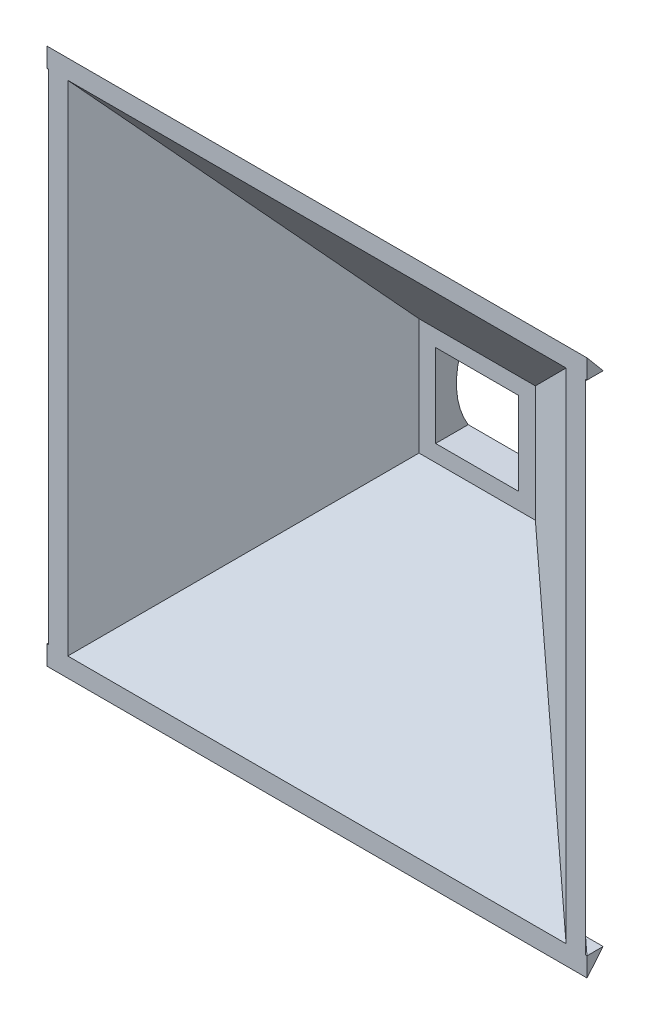
ISO-10303-21;
HEADER;
FILE_DESCRIPTION(('STEP AP214'),'2;1');
FILE_NAME('part.step','',(''),(''),'','','');
FILE_SCHEMA(('AUTOMOTIVE_DESIGN { 1 0 10303 214 1 1 1 1 }'));
ENDSEC;
DATA;
#1=APPLICATION_CONTEXT('core data for automotive mechanical design processes');
#2=APPLICATION_PROTOCOL_DEFINITION('international standard','automotive_design',2000,#1);
#3=PRODUCT_CONTEXT('',#1,'mechanical');
#4=PRODUCT('Part','Part','',(#3));
#5=PRODUCT_RELATED_PRODUCT_CATEGORY('part','',(#4));
#6=PRODUCT_DEFINITION_FORMATION('','',#4);
#7=PRODUCT_DEFINITION_CONTEXT('part definition',#1,'design');
#8=PRODUCT_DEFINITION('design','',#6,#7);
#9=PRODUCT_DEFINITION_SHAPE('','',#8);
#10=(LENGTH_UNIT() NAMED_UNIT(*) SI_UNIT(.MILLI.,.METRE.));
#11=(NAMED_UNIT(*) PLANE_ANGLE_UNIT() SI_UNIT($,.RADIAN.));
#12=(NAMED_UNIT(*) SI_UNIT($,.STERADIAN.) SOLID_ANGLE_UNIT());
#13=UNCERTAINTY_MEASURE_WITH_UNIT(LENGTH_MEASURE(1.E-05),#10,'distance_accuracy_value','');
#14=(GEOMETRIC_REPRESENTATION_CONTEXT(3) GLOBAL_UNCERTAINTY_ASSIGNED_CONTEXT((#13)) GLOBAL_UNIT_ASSIGNED_CONTEXT((#10,
#11,#12)) REPRESENTATION_CONTEXT('',''));
#15=CARTESIAN_POINT('',(0.,0.,0.));
#16=DIRECTION('',(0.,0.,1.));
#17=DIRECTION('',(1.,0.,0.));
#18=AXIS2_PLACEMENT_3D('',#15,#16,#17);
#19=CARTESIAN_POINT('',(-7.,30.,10.0594686833038));
#20=DIRECTION('',(0.642787609686543,0.,0.766044443118975));
#21=DIRECTION('',(0.766044443118975,0.,-0.642787609686543));
#22=AXIS2_PLACEMENT_3D('',#19,#20,#21);
#23=PLANE('',#22);
#24=DIRECTION('',(-0.607937743091542,0.608431543657136,0.510120336006866));
#25=VECTOR('',#24,1.);
#26=CARTESIAN_POINT('',(-16.3635474571613,14.0566394287994,17.9164179011189));
#27=LINE('',#26,#25);
#28=CARTESIAN_POINT('',(-9.31263516821422,7.,12.));
#29=VERTEX_POINT('',#28);
#30=CARTESIAN_POINT('',(-32.2939684617835,30.,31.2836282905963));
#31=VERTEX_POINT('',#30);
#32=EDGE_CURVE('E362',#29,#31,#27,.T.);
#33=ORIENTED_EDGE('',*,*,#32,.F.);
#34=DIRECTION('',(-0.766044443118975,0.,0.642787609686543));
#35=VECTOR('',#34,1.);
#36=CARTESIAN_POINT('',(-6.99999999999999,7.,10.0594686833038));
#37=LINE('',#36,#35);
#38=CARTESIAN_POINT('',(-6.99999999999999,7.,10.0594686833038));
#39=VERTEX_POINT('',#38);
#40=EDGE_CURVE('E370',#39,#29,#37,.T.);
#41=ORIENTED_EDGE('',*,*,#40,.F.);
#42=DIRECTION('',(0.,-1.,0.));
#43=VECTOR('',#42,1.);
#44=CARTESIAN_POINT('',(-7.,30.,10.0594686833038));
#45=LINE('',#44,#43);
#46=CARTESIAN_POINT('',(-6.99999999999999,-7.,10.0594686833038));
#47=VERTEX_POINT('',#46);
#48=EDGE_CURVE('E417',#39,#47,#45,.T.);
#49=ORIENTED_EDGE('',*,*,#48,.T.);
#50=DIRECTION('',(0.766044443118975,0.,-0.642787609686543));
#51=VECTOR('',#50,1.);
#52=CARTESIAN_POINT('',(-7.00000000000001,-7.,10.0594686833038));
#53=LINE('',#52,#51);
#54=CARTESIAN_POINT('',(-9.31263516821424,-7.,12.));
#55=VERTEX_POINT('',#54);
#56=EDGE_CURVE('E67',#55,#47,#53,.T.);
#57=ORIENTED_EDGE('',*,*,#56,.F.);
#58=DIRECTION('',(0.607937743091542,0.608431543657136,-0.510120336006866));
#59=VECTOR('',#58,1.);
#60=CARTESIAN_POINT('',(5.82976251143604,8.15469717022086,-0.705980308134369));
#61=LINE('',#60,#59);
#62=CARTESIAN_POINT('',(-32.2939684617835,-30.,31.2836282905963));
#63=VERTEX_POINT('',#62);
#64=EDGE_CURVE('E400',#63,#55,#61,.T.);
#65=ORIENTED_EDGE('',*,*,#64,.F.);
#66=DIRECTION('',(0.,-1.,0.));
#67=VECTOR('',#66,1.);
#68=CARTESIAN_POINT('',(-32.2939684617835,30.,31.2836282905963));
#69=LINE('',#68,#67);
#70=EDGE_CURVE('E420',#31,#63,#69,.T.);
#71=ORIENTED_EDGE('',*,*,#70,.F.);
#72=EDGE_LOOP('',(#33,#41,#49,#57,#65,#71));
#73=FACE_BOUND('',#72,.T.);
#74=ADVANCED_FACE('F43',(#73),#23,.F.);
#75=CARTESIAN_POINT('',(-7.,30.,12.));
#76=DIRECTION('',(-0.642787609686543,0.,-0.766044443118975));
#77=DIRECTION('',(-0.766044443118975,0.,0.642787609686543));
#78=AXIS2_PLACEMENT_3D('',#75,#76,#77);
#79=PLANE('',#78);
#80=DIRECTION('',(0.607937743091542,-0.608431543657135,-0.510120336006866));
#81=VECTOR('',#80,1.);
#82=CARTESIAN_POINT('',(-15.5074354879623,15.5143456962911,19.1385859802137));
#83=LINE('',#82,#81);
#84=CARTESIAN_POINT('',(-29.9813332935693,30.,31.2836282905963));
#85=VERTEX_POINT('',#84);
#86=CARTESIAN_POINT('',(-7.,7.,12.));
#87=VERTEX_POINT('',#86);
#88=EDGE_CURVE('E358',#85,#87,#83,.T.);
#89=ORIENTED_EDGE('',*,*,#88,.F.);
#90=DIRECTION('',(0.,-1.,0.));
#91=VECTOR('',#90,1.);
#92=CARTESIAN_POINT('',(-29.9813332935693,30.,31.2836282905963));
#93=LINE('',#92,#91);
#94=CARTESIAN_POINT('',(-29.9813332935693,-30.,31.2836282905963));
#95=VERTEX_POINT('',#94);
#96=EDGE_CURVE('E412',#85,#95,#93,.T.);
#97=ORIENTED_EDGE('',*,*,#96,.T.);
#98=DIRECTION('',(-0.607937743091542,-0.608431543657135,0.510120336006866));
#99=VECTOR('',#98,1.);
#100=CARTESIAN_POINT('',(6.68587448063501,6.69699090272918,0.516187770960505));
#101=LINE('',#100,#99);
#102=CARTESIAN_POINT('',(-7.,-7.,12.));
#103=VERTEX_POINT('',#102);
#104=EDGE_CURVE('E396',#103,#95,#101,.T.);
#105=ORIENTED_EDGE('',*,*,#104,.F.);
#106=DIRECTION('',(0.,-1.,0.));
#107=VECTOR('',#106,1.);
#108=CARTESIAN_POINT('',(-7.,7.,12.));
#109=LINE('',#108,#107);
#110=EDGE_CURVE('E484',#87,#103,#109,.T.);
#111=ORIENTED_EDGE('',*,*,#110,.F.);
#112=EDGE_LOOP('',(#89,#97,#105,#111));
#113=FACE_BOUND('',#112,.T.);
#114=ADVANCED_FACE('F594',(#113),#79,.F.);
#115=CARTESIAN_POINT('',(7.,30.,10.0594686833038));
#116=DIRECTION('',(-0.642787609686543,0.,0.766044443118975));
#117=DIRECTION('',(0.766044443118975,0.,0.642787609686543));
#118=AXIS2_PLACEMENT_3D('',#115,#116,#117);
#119=PLANE('',#118);
#120=DIRECTION('',(-0.607937743091542,-0.608431543657136,-0.510120336006866));
#121=VECTOR('',#120,1.);
#122=CARTESIAN_POINT('',(16.3635474571613,14.0566394287994,17.9164179011189));
#123=LINE('',#122,#121);
#124=CARTESIAN_POINT('',(32.2939684617835,30.,31.2836282905963));
#125=VERTEX_POINT('',#124);
#126=CARTESIAN_POINT('',(9.31263516821424,7.,12.));
#127=VERTEX_POINT('',#126);
#128=EDGE_CURVE('E354',#125,#127,#123,.T.);
#129=ORIENTED_EDGE('',*,*,#128,.F.);
#130=DIRECTION('',(0.,-1.,0.));
#131=VECTOR('',#130,1.);
#132=CARTESIAN_POINT('',(32.2939684617835,30.,31.2836282905963));
#133=LINE('',#132,#131);
#134=CARTESIAN_POINT('',(32.2939684617835,-30.,31.2836282905963));
#135=VERTEX_POINT('',#134);
#136=EDGE_CURVE('E405',#125,#135,#133,.T.);
#137=ORIENTED_EDGE('',*,*,#136,.T.);
#138=DIRECTION('',(0.607937743091542,-0.608431543657136,0.510120336006866));
#139=VECTOR('',#138,1.);
#140=CARTESIAN_POINT('',(-5.82976251143604,8.15469717022086,-0.705980308134369));
#141=LINE('',#140,#139);
#142=CARTESIAN_POINT('',(9.31263516821424,-7.,12.));
#143=VERTEX_POINT('',#142);
#144=EDGE_CURVE('E392',#143,#135,#141,.T.);
#145=ORIENTED_EDGE('',*,*,#144,.F.);
#146=DIRECTION('',(0.766044443118975,0.,0.642787609686543));
#147=VECTOR('',#146,1.);
#148=CARTESIAN_POINT('',(7.00000000000001,-7.,10.0594686833038));
#149=LINE('',#148,#147);
#150=CARTESIAN_POINT('',(7.,-7.,10.0594686833038));
#151=VERTEX_POINT('',#150);
#152=EDGE_CURVE('E52',#151,#143,#149,.T.);
#153=ORIENTED_EDGE('',*,*,#152,.F.);
#154=DIRECTION('',(0.,-1.,0.));
#155=VECTOR('',#154,1.);
#156=CARTESIAN_POINT('',(7.,30.,10.0594686833038));
#157=LINE('',#156,#155);
#158=CARTESIAN_POINT('',(7.,7.,10.0594686833038));
#159=VERTEX_POINT('',#158);
#160=EDGE_CURVE('E413',#159,#151,#157,.T.);
#161=ORIENTED_EDGE('',*,*,#160,.F.);
#162=DIRECTION('',(-0.766044443118975,0.,-0.642787609686543));
#163=VECTOR('',#162,1.);
#164=CARTESIAN_POINT('',(6.99999999999999,7.,10.0594686833038));
#165=LINE('',#164,#163);
#166=EDGE_CURVE('E366',#127,#159,#165,.T.);
#167=ORIENTED_EDGE('',*,*,#166,.F.);
#168=EDGE_LOOP('',(#129,#137,#145,#153,#161,#167));
#169=FACE_BOUND('',#168,.T.);
#170=ADVANCED_FACE('F519',(#169),#119,.F.);
#171=CARTESIAN_POINT('',(7.,30.,12.));
#172=DIRECTION('',(0.642787609686543,0.,-0.766044443118975));
#173=DIRECTION('',(-0.766044443118975,0.,-0.642787609686543));
#174=AXIS2_PLACEMENT_3D('',#171,#172,#173);
#175=PLANE('',#174);
#176=DIRECTION('',(0.607937743091542,0.608431543657135,0.510120336006866));
#177=VECTOR('',#176,1.);
#178=CARTESIAN_POINT('',(15.5074354879623,15.5143456962911,19.1385859802137));
#179=LINE('',#178,#177);
#180=CARTESIAN_POINT('',(7.,7.,12.));
#181=VERTEX_POINT('',#180);
#182=CARTESIAN_POINT('',(29.9813332935693,30.,31.2836282905963));
#183=VERTEX_POINT('',#182);
#184=EDGE_CURVE('E350',#181,#183,#179,.T.);
#185=ORIENTED_EDGE('',*,*,#184,.F.);
#186=DIRECTION('',(0.,1.,0.));
#187=VECTOR('',#186,1.);
#188=CARTESIAN_POINT('',(7.,7.,12.));
#189=LINE('',#188,#187);
#190=CARTESIAN_POINT('',(7.,-7.,12.));
#191=VERTEX_POINT('',#190);
#192=EDGE_CURVE('E492',#191,#181,#189,.T.);
#193=ORIENTED_EDGE('',*,*,#192,.F.);
#194=DIRECTION('',(-0.607937743091542,0.608431543657135,-0.510120336006866));
#195=VECTOR('',#194,1.);
#196=CARTESIAN_POINT('',(-6.68587448063501,6.69699090272918,0.516187770960505));
#197=LINE('',#196,#195);
#198=CARTESIAN_POINT('',(29.9813332935693,-30.,31.2836282905963));
#199=VERTEX_POINT('',#198);
#200=EDGE_CURVE('E387',#199,#191,#197,.T.);
#201=ORIENTED_EDGE('',*,*,#200,.F.);
#202=DIRECTION('',(0.,-1.,0.));
#203=VECTOR('',#202,1.);
#204=CARTESIAN_POINT('',(29.9813332935693,30.,31.2836282905963));
#205=LINE('',#204,#203);
#206=EDGE_CURVE('E408',#183,#199,#205,.T.);
#207=ORIENTED_EDGE('',*,*,#206,.F.);
#208=EDGE_LOOP('',(#185,#193,#201,#207));
#209=FACE_BOUND('',#208,.T.);
#210=ADVANCED_FACE('F602',(#209),#175,.F.);
#211=CARTESIAN_POINT('',(-7.,7.,12.));
#212=DIRECTION('',(0.,-1.,0.));
#213=DIRECTION('',(0.,0.,-1.));
#214=AXIS2_PLACEMENT_3D('',#211,#212,#213);
#215=PLANE('',#214);
#216=DIRECTION('',(-1.,0.,0.));
#217=VECTOR('',#216,1.);
#218=CARTESIAN_POINT('',(32.5,7.,10.0594686833038));
#219=LINE('',#218,#217);
#220=EDGE_CURVE('E342',#159,#39,#219,.T.);
#221=ORIENTED_EDGE('',*,*,#220,.F.);
#222=DIRECTION('',(0.,0.,-1.));
#223=VECTOR('',#222,1.);
#224=CARTESIAN_POINT('',(7.,7.,12.));
#225=LINE('',#224,#223);
#226=CARTESIAN_POINT('',(7.,7.,6.42261628933256));
#227=VERTEX_POINT('',#226);
#228=EDGE_CURVE('E496',#159,#227,#225,.T.);
#229=ORIENTED_EDGE('',*,*,#228,.T.);
#230=DIRECTION('',(1.,0.,0.));
#231=VECTOR('',#230,1.);
#232=CARTESIAN_POINT('',(-23.,7.,6.42261628933256));
#233=LINE('',#232,#231);
#234=CARTESIAN_POINT('',(-7.,7.,6.42261628933256));
#235=VERTEX_POINT('',#234);
#236=EDGE_CURVE('E448',#227,#235,#233,.F.);
#237=ORIENTED_EDGE('',*,*,#236,.T.);
#238=DIRECTION('',(0.,0.,-1.));
#239=VECTOR('',#238,1.);
#240=CARTESIAN_POINT('',(-7.,7.,12.));
#241=LINE('',#240,#239);
#242=EDGE_CURVE('E505',#39,#235,#241,.T.);
#243=ORIENTED_EDGE('',*,*,#242,.F.);
#244=EDGE_LOOP('',(#221,#229,#237,#243));
#245=FACE_BOUND('',#244,.T.);
#246=ADVANCED_FACE('F45',(#245),#215,.F.);
#247=CARTESIAN_POINT('',(-7.,-7.,12.));
#248=DIRECTION('',(0.,1.,0.));
#249=DIRECTION('',(0.,0.,1.));
#250=AXIS2_PLACEMENT_3D('',#247,#248,#249);
#251=PLANE('',#250);
#252=DIRECTION('',(-1.,0.,0.));
#253=VECTOR('',#252,1.);
#254=CARTESIAN_POINT('',(32.5,-7.,10.0594686833038));
#255=LINE('',#254,#253);
#256=EDGE_CURVE('E378',#151,#47,#255,.T.);
#257=ORIENTED_EDGE('',*,*,#256,.T.);
#258=DIRECTION('',(0.,0.,-1.));
#259=VECTOR('',#258,1.);
#260=CARTESIAN_POINT('',(-7.,-7.,12.));
#261=LINE('',#260,#259);
#262=CARTESIAN_POINT('',(-7.,-7.,6.42261628933256));
#263=VERTEX_POINT('',#262);
#264=EDGE_CURVE('E502',#47,#263,#261,.T.);
#265=ORIENTED_EDGE('',*,*,#264,.T.);
#266=DIRECTION('',(1.,0.,0.));
#267=VECTOR('',#266,1.);
#268=CARTESIAN_POINT('',(-23.,-7.,6.42261628933256));
#269=LINE('',#268,#267);
#270=CARTESIAN_POINT('',(7.,-7.,6.42261628933256));
#271=VERTEX_POINT('',#270);
#272=EDGE_CURVE('E440',#263,#271,#269,.T.);
#273=ORIENTED_EDGE('',*,*,#272,.T.);
#274=DIRECTION('',(0.,0.,-1.));
#275=VECTOR('',#274,1.);
#276=CARTESIAN_POINT('',(7.,-7.,12.));
#277=LINE('',#276,#275);
#278=EDGE_CURVE('E499',#151,#271,#277,.T.);
#279=ORIENTED_EDGE('',*,*,#278,.F.);
#280=EDGE_LOOP('',(#257,#265,#273,#279));
#281=FACE_BOUND('',#280,.T.);
#282=ADVANCED_FACE('F529',(#281),#251,.F.);
#283=CARTESIAN_POINT('',(-7.,7.,12.));
#284=DIRECTION('',(1.,0.,0.));
#285=DIRECTION('',(0.,0.,-1.));
#286=AXIS2_PLACEMENT_3D('',#283,#284,#285);
#287=PLANE('',#286);
#288=ORIENTED_EDGE('',*,*,#48,.F.);
#289=ORIENTED_EDGE('',*,*,#242,.T.);
#290=CARTESIAN_POINT('',(-7.,0.,0.));
#291=DIRECTION('',(1.,0.,0.));
#292=DIRECTION('',(0.,0.,-1.));
#293=AXIS2_PLACEMENT_3D('',#290,#291,#292);
#294=CIRCLE('',#293,9.5);
#295=EDGE_CURVE('E444',#235,#263,#294,.T.);
#296=ORIENTED_EDGE('',*,*,#295,.T.);
#297=ORIENTED_EDGE('',*,*,#264,.F.);
#298=EDGE_LOOP('',(#288,#289,#296,#297));
#299=FACE_BOUND('',#298,.T.);
#300=ADVANCED_FACE('F541',(#299),#287,.F.);
#301=CARTESIAN_POINT('',(0.,0.,12.));
#302=DIRECTION('',(0.,0.,-1.));
#303=DIRECTION('',(-1.,0.,0.));
#304=AXIS2_PLACEMENT_3D('',#301,#302,#303);
#305=PLANE('',#304);
#306=DIRECTION('',(-1.,0.,0.));
#307=VECTOR('',#306,1.);
#308=CARTESIAN_POINT('',(-7.,7.,12.));
#309=LINE('',#308,#307);
#310=EDGE_CURVE('E481',#181,#87,#309,.T.);
#311=ORIENTED_EDGE('',*,*,#310,.T.);
#312=ORIENTED_EDGE('',*,*,#110,.T.);
#313=DIRECTION('',(1.,0.,0.));
#314=VECTOR('',#313,1.);
#315=CARTESIAN_POINT('',(-7.,-7.,12.));
#316=LINE('',#315,#314);
#317=EDGE_CURVE('E488',#103,#191,#316,.T.);
#318=ORIENTED_EDGE('',*,*,#317,.T.);
#319=ORIENTED_EDGE('',*,*,#192,.T.);
#320=EDGE_LOOP('',(#311,#312,#318,#319));
#321=FACE_BOUND('',#320,.T.);
#322=DIRECTION('',(0.,1.,0.));
#323=VECTOR('',#322,1.);
#324=CARTESIAN_POINT('',(5.,5.,12.));
#325=LINE('',#324,#323);
#326=CARTESIAN_POINT('',(5.,-5.,12.));
#327=VERTEX_POINT('',#326);
#328=CARTESIAN_POINT('',(5.,5.,12.));
#329=VERTEX_POINT('',#328);
#330=EDGE_CURVE('E452',#327,#329,#325,.T.);
#331=ORIENTED_EDGE('',*,*,#330,.F.);
#332=DIRECTION('',(1.,0.,0.));
#333=VECTOR('',#332,1.);
#334=CARTESIAN_POINT('',(-5.,-5.,12.));
#335=LINE('',#334,#333);
#336=CARTESIAN_POINT('',(-5.,-5.,12.));
#337=VERTEX_POINT('',#336);
#338=EDGE_CURVE('E462',#337,#327,#335,.T.);
#339=ORIENTED_EDGE('',*,*,#338,.F.);
#340=DIRECTION('',(0.,-1.,0.));
#341=VECTOR('',#340,1.);
#342=CARTESIAN_POINT('',(-5.,5.,12.));
#343=LINE('',#342,#341);
#344=CARTESIAN_POINT('',(-5.,5.,12.));
#345=VERTEX_POINT('',#344);
#346=EDGE_CURVE('E458',#345,#337,#343,.T.);
#347=ORIENTED_EDGE('',*,*,#346,.F.);
#348=DIRECTION('',(-1.,0.,0.));
#349=VECTOR('',#348,1.);
#350=CARTESIAN_POINT('',(-5.,5.,12.));
#351=LINE('',#350,#349);
#352=EDGE_CURVE('E455',#329,#345,#351,.T.);
#353=ORIENTED_EDGE('',*,*,#352,.F.);
#354=EDGE_LOOP('',(#331,#339,#347,#353));
#355=FACE_BOUND('',#354,.T.);
#356=ADVANCED_FACE('F596',(#321,#355),#305,.F.);
#357=CARTESIAN_POINT('',(7.,7.,12.));
#358=DIRECTION('',(-1.,0.,0.));
#359=DIRECTION('',(0.,0.,1.));
#360=AXIS2_PLACEMENT_3D('',#357,#358,#359);
#361=PLANE('',#360);
#362=ORIENTED_EDGE('',*,*,#228,.F.);
#363=ORIENTED_EDGE('',*,*,#160,.T.);
#364=ORIENTED_EDGE('',*,*,#278,.T.);
#365=CARTESIAN_POINT('',(7.,0.,0.));
#366=DIRECTION('',(1.,0.,0.));
#367=DIRECTION('',(0.,0.,-1.));
#368=AXIS2_PLACEMENT_3D('',#365,#366,#367);
#369=CIRCLE('',#368,9.5);
#370=EDGE_CURVE('E424',#227,#271,#369,.T.);
#371=ORIENTED_EDGE('',*,*,#370,.F.);
#372=EDGE_LOOP('',(#362,#363,#364,#371));
#373=FACE_BOUND('',#372,.T.);
#374=ADVANCED_FACE('F524',(#373),#361,.F.);
#375=CARTESIAN_POINT('',(5.,5.,12.));
#376=DIRECTION('',(-1.,0.,0.));
#377=DIRECTION('',(0.,0.,1.));
#378=AXIS2_PLACEMENT_3D('',#375,#376,#377);
#379=PLANE('',#378);
#380=CARTESIAN_POINT('',(5.,0.,0.));
#381=DIRECTION('',(-1.,0.,0.));
#382=DIRECTION('',(0.,0.,1.));
#383=AXIS2_PLACEMENT_3D('',#380,#381,#382);
#384=CIRCLE('',#383,9.5);
#385=CARTESIAN_POINT('',(5.,-5.,8.07774721070176));
#386=VERTEX_POINT('',#385);
#387=CARTESIAN_POINT('',(5.,5.,8.07774721070176));
#388=VERTEX_POINT('',#387);
#389=EDGE_CURVE('E437',#386,#388,#384,.T.);
#390=ORIENTED_EDGE('',*,*,#389,.F.);
#391=DIRECTION('',(0.,0.,-1.));
#392=VECTOR('',#391,1.);
#393=CARTESIAN_POINT('',(5.,-5.,12.));
#394=LINE('',#393,#392);
#395=EDGE_CURVE('E465',#327,#386,#394,.T.);
#396=ORIENTED_EDGE('',*,*,#395,.F.);
#397=ORIENTED_EDGE('',*,*,#330,.T.);
#398=DIRECTION('',(0.,0.,-1.));
#399=VECTOR('',#398,1.);
#400=CARTESIAN_POINT('',(5.,5.,12.));
#401=LINE('',#400,#399);
#402=EDGE_CURVE('E477',#329,#388,#401,.T.);
#403=ORIENTED_EDGE('',*,*,#402,.T.);
#404=EDGE_LOOP('',(#390,#396,#397,#403));
#405=FACE_BOUND('',#404,.T.);
#406=ADVANCED_FACE('F633',(#405),#379,.T.);
#407=CARTESIAN_POINT('',(-5.,5.,12.));
#408=DIRECTION('',(0.,-1.,0.));
#409=DIRECTION('',(0.,0.,-1.));
#410=AXIS2_PLACEMENT_3D('',#407,#408,#409);
#411=PLANE('',#410);
#412=DIRECTION('',(1.,0.,0.));
#413=VECTOR('',#412,1.);
#414=CARTESIAN_POINT('',(-23.,5.,8.07774721070176));
#415=LINE('',#414,#413);
#416=CARTESIAN_POINT('',(-5.,5.,8.07774721070176));
#417=VERTEX_POINT('',#416);
#418=EDGE_CURVE('E434',#388,#417,#415,.F.);
#419=ORIENTED_EDGE('',*,*,#418,.F.);
#420=ORIENTED_EDGE('',*,*,#402,.F.);
#421=ORIENTED_EDGE('',*,*,#352,.T.);
#422=DIRECTION('',(0.,0.,-1.));
#423=VECTOR('',#422,1.);
#424=CARTESIAN_POINT('',(-5.,5.,12.));
#425=LINE('',#424,#423);
#426=EDGE_CURVE('E473',#345,#417,#425,.T.);
#427=ORIENTED_EDGE('',*,*,#426,.T.);
#428=EDGE_LOOP('',(#419,#420,#421,#427));
#429=FACE_BOUND('',#428,.T.);
#430=ADVANCED_FACE('F629',(#429),#411,.T.);
#431=CARTESIAN_POINT('',(-5.,5.,12.));
#432=DIRECTION('',(1.,0.,0.));
#433=DIRECTION('',(0.,0.,-1.));
#434=AXIS2_PLACEMENT_3D('',#431,#432,#433);
#435=PLANE('',#434);
#436=CARTESIAN_POINT('',(-5.,0.,0.));
#437=DIRECTION('',(1.,0.,0.));
#438=DIRECTION('',(0.,0.,-1.));
#439=AXIS2_PLACEMENT_3D('',#436,#437,#438);
#440=CIRCLE('',#439,9.5);
#441=CARTESIAN_POINT('',(-5.,-5.,8.07774721070176));
#442=VERTEX_POINT('',#441);
#443=EDGE_CURVE('E431',#417,#442,#440,.T.);
#444=ORIENTED_EDGE('',*,*,#443,.F.);
#445=ORIENTED_EDGE('',*,*,#426,.F.);
#446=ORIENTED_EDGE('',*,*,#346,.T.);
#447=DIRECTION('',(0.,0.,-1.));
#448=VECTOR('',#447,1.);
#449=CARTESIAN_POINT('',(-5.,-5.,12.));
#450=LINE('',#449,#448);
#451=EDGE_CURVE('E469',#337,#442,#450,.T.);
#452=ORIENTED_EDGE('',*,*,#451,.T.);
#453=EDGE_LOOP('',(#444,#445,#446,#452));
#454=FACE_BOUND('',#453,.T.);
#455=ADVANCED_FACE('F625',(#454),#435,.T.);
#456=CARTESIAN_POINT('',(-5.,-5.,12.));
#457=DIRECTION('',(0.,1.,0.));
#458=DIRECTION('',(0.,0.,1.));
#459=AXIS2_PLACEMENT_3D('',#456,#457,#458);
#460=PLANE('',#459);
#461=DIRECTION('',(1.,0.,0.));
#462=VECTOR('',#461,1.);
#463=CARTESIAN_POINT('',(-23.,-5.,8.07774721070176));
#464=LINE('',#463,#462);
#465=EDGE_CURVE('E427',#442,#386,#464,.T.);
#466=ORIENTED_EDGE('',*,*,#465,.F.);
#467=ORIENTED_EDGE('',*,*,#451,.F.);
#468=ORIENTED_EDGE('',*,*,#338,.T.);
#469=ORIENTED_EDGE('',*,*,#395,.T.);
#470=EDGE_LOOP('',(#466,#467,#468,#469));
#471=FACE_BOUND('',#470,.T.);
#472=ADVANCED_FACE('F621',(#471),#460,.T.);
#473=CARTESIAN_POINT('',(-23.,0.,0.));
#474=DIRECTION('',(1.,0.,0.));
#475=DIRECTION('',(0.,0.,-1.));
#476=AXIS2_PLACEMENT_3D('',#473,#474,#475);
#477=CYLINDRICAL_SURFACE('',#476,9.5);
#478=ORIENTED_EDGE('',*,*,#389,.T.);
#479=ORIENTED_EDGE('',*,*,#418,.T.);
#480=ORIENTED_EDGE('',*,*,#443,.T.);
#481=ORIENTED_EDGE('',*,*,#465,.T.);
#482=EDGE_LOOP('',(#478,#479,#480,#481));
#483=FACE_BOUND('',#482,.T.);
#484=ORIENTED_EDGE('',*,*,#370,.T.);
#485=ORIENTED_EDGE('',*,*,#272,.F.);
#486=ORIENTED_EDGE('',*,*,#295,.F.);
#487=ORIENTED_EDGE('',*,*,#236,.F.);
#488=EDGE_LOOP('',(#484,#485,#486,#487));
#489=FACE_BOUND('',#488,.T.);
#490=ADVANCED_FACE('F544',(#483,#489),#477,.F.);
#491=CARTESIAN_POINT('',(-32.2939684617835,30.,31.2836282905963));
#492=DIRECTION('',(0.,0.,-1.));
#493=DIRECTION('',(-1.,0.,0.));
#494=AXIS2_PLACEMENT_3D('',#491,#492,#493);
#495=PLANE('',#494);
#496=ORIENTED_EDGE('',*,*,#96,.F.);
#497=DIRECTION('',(-1.,0.,0.));
#498=VECTOR('',#497,1.);
#499=CARTESIAN_POINT('',(32.5,30.,31.2836282905963));
#500=LINE('',#499,#498);
#501=EDGE_CURVE('E343',#183,#85,#500,.T.);
#502=ORIENTED_EDGE('',*,*,#501,.F.);
#503=ORIENTED_EDGE('',*,*,#206,.T.);
#504=DIRECTION('',(-1.,0.,0.));
#505=VECTOR('',#504,1.);
#506=CARTESIAN_POINT('',(32.5,-30.,31.2836282905963));
#507=LINE('',#506,#505);
#508=EDGE_CURVE('E388',#199,#95,#507,.T.);
#509=ORIENTED_EDGE('',*,*,#508,.T.);
#510=EDGE_LOOP('',(#496,#502,#503,#509));
#511=FACE_BOUND('',#510,.T.);
#512=ORIENTED_EDGE('',*,*,#70,.T.);
#513=CARTESIAN_POINT('',(-32.5,-30.,31.2836282905963));
#514=VERTEX_POINT('',#513);
#515=EDGE_CURVE('E382',#63,#514,#507,.T.);
#516=ORIENTED_EDGE('',*,*,#515,.T.);
#517=DIRECTION('',(0.,-1.,0.));
#518=VECTOR('',#517,1.);
#519=CARTESIAN_POINT('',(-32.5,-32.3145136180507,31.2836282905963));
#520=LINE('',#519,#518);
#521=CARTESIAN_POINT('',(-32.5,-32.3145136180507,31.2836282905963));
#522=VERTEX_POINT('',#521);
#523=EDGE_CURVE('E245',#514,#522,#520,.T.);
#524=ORIENTED_EDGE('',*,*,#523,.T.);
#525=DIRECTION('',(-1.,0.,0.));
#526=VECTOR('',#525,1.);
#527=CARTESIAN_POINT('',(32.5,-32.3145136180507,31.2836282905963));
#528=LINE('',#527,#526);
#529=CARTESIAN_POINT('',(32.5,-32.3145136180507,31.2836282905963));
#530=VERTEX_POINT('',#529);
#531=EDGE_CURVE('E279',#530,#522,#528,.T.);
#532=ORIENTED_EDGE('',*,*,#531,.F.);
#533=DIRECTION('',(0.,-1.,0.));
#534=VECTOR('',#533,1.);
#535=CARTESIAN_POINT('',(32.5,-32.3145136180507,31.2836282905963));
#536=LINE('',#535,#534);
#537=CARTESIAN_POINT('',(32.5,-30.,31.2836282905963));
#538=VERTEX_POINT('',#537);
#539=EDGE_CURVE('E256',#538,#530,#536,.T.);
#540=ORIENTED_EDGE('',*,*,#539,.F.);
#541=EDGE_CURVE('E383',#538,#135,#507,.T.);
#542=ORIENTED_EDGE('',*,*,#541,.T.);
#543=ORIENTED_EDGE('',*,*,#136,.F.);
#544=CARTESIAN_POINT('',(32.5,30.,31.2836282905963));
#545=VERTEX_POINT('',#544);
#546=EDGE_CURVE('E339',#545,#125,#500,.T.);
#547=ORIENTED_EDGE('',*,*,#546,.F.);
#548=DIRECTION('',(0.,-1.,0.));
#549=VECTOR('',#548,1.);
#550=CARTESIAN_POINT('',(32.5,32.3145136180506,31.2836282905963));
#551=LINE('',#550,#549);
#552=CARTESIAN_POINT('',(32.5,32.3145136180506,31.2836282905963));
#553=VERTEX_POINT('',#552);
#554=EDGE_CURVE('E232',#553,#545,#551,.T.);
#555=ORIENTED_EDGE('',*,*,#554,.F.);
#556=DIRECTION('',(-1.,0.,0.));
#557=VECTOR('',#556,1.);
#558=CARTESIAN_POINT('',(32.5,32.3145136180506,31.2836282905963));
#559=LINE('',#558,#557);
#560=CARTESIAN_POINT('',(-32.5,32.3145136180506,31.2836282905963));
#561=VERTEX_POINT('',#560);
#562=EDGE_CURVE('E227',#553,#561,#559,.T.);
#563=ORIENTED_EDGE('',*,*,#562,.T.);
#564=DIRECTION('',(0.,-1.,0.));
#565=VECTOR('',#564,1.);
#566=CARTESIAN_POINT('',(-32.5,32.3145136180506,31.2836282905963));
#567=LINE('',#566,#565);
#568=CARTESIAN_POINT('',(-32.5,30.,31.2836282905963));
#569=VERTEX_POINT('',#568);
#570=EDGE_CURVE('E240',#561,#569,#567,.T.);
#571=ORIENTED_EDGE('',*,*,#570,.T.);
#572=EDGE_CURVE('E338',#31,#569,#500,.T.);
#573=ORIENTED_EDGE('',*,*,#572,.F.);
#574=EDGE_LOOP('',(#512,#516,#524,#532,#540,#542,#543,#547,#555,#563,#571,#573));
#575=FACE_BOUND('',#574,.T.);
#576=ADVANCED_FACE('F554',(#511,#575),#495,.F.);
#577=CARTESIAN_POINT('',(32.5,-7.,12.));
#578=DIRECTION('',(0.,-0.642481319030199,-0.766301347184785));
#579=DIRECTION('',(0.,0.766301347184785,-0.642481319030199));
#580=AXIS2_PLACEMENT_3D('',#577,#578,#579);
#581=PLANE('',#580);
#582=ORIENTED_EDGE('',*,*,#317,.F.);
#583=ORIENTED_EDGE('',*,*,#104,.T.);
#584=ORIENTED_EDGE('',*,*,#508,.F.);
#585=ORIENTED_EDGE('',*,*,#200,.T.);
#586=EDGE_LOOP('',(#582,#583,#584,#585));
#587=FACE_BOUND('',#586,.T.);
#588=ADVANCED_FACE('F591',(#587),#581,.F.);
#589=CARTESIAN_POINT('',(32.5,-7.,10.0594686833038));
#590=DIRECTION('',(0.,-1.,0.));
#591=DIRECTION('',(0.,0.,-1.));
#592=AXIS2_PLACEMENT_3D('',#589,#590,#591);
#593=PLANE('',#592);
#594=DIRECTION('',(-1.,0.,0.));
#595=VECTOR('',#594,1.);
#596=CARTESIAN_POINT('',(32.5,-7.,12.));
#597=LINE('',#596,#595);
#598=CARTESIAN_POINT('',(9.33147269391767,-7.,12.));
#599=VERTEX_POINT('',#598);
#600=EDGE_CURVE('E375',#599,#143,#597,.T.);
#601=ORIENTED_EDGE('',*,*,#600,.F.);
#602=DIRECTION('',(-0.76860418999111,0.,-0.63972462757667));
#603=VECTOR('',#602,1.);
#604=CARTESIAN_POINT('',(22.0641862222332,-6.99999999999999,22.5976919278001));
#605=LINE('',#604,#603);
#606=EDGE_CURVE('E328',#599,#151,#605,.T.);
#607=ORIENTED_EDGE('',*,*,#606,.T.);
#608=ORIENTED_EDGE('',*,*,#152,.T.);
#609=EDGE_LOOP('',(#601,#607,#608));
#610=FACE_BOUND('',#609,.T.);
#611=ADVANCED_FACE('F514',(#610),#593,.F.);
#612=ORIENTED_EDGE('',*,*,#541,.F.);
#613=DIRECTION('',(-0.611045442878352,0.606600713136935,-0.50858533360623));
#614=VECTOR('',#613,1.);
#615=CARTESIAN_POINT('',(17.982057100258,-15.5876602650352,19.2000542798636));
#616=LINE('',#615,#614);
#617=EDGE_CURVE('E334',#538,#599,#616,.T.);
#618=ORIENTED_EDGE('',*,*,#617,.T.);
#619=ORIENTED_EDGE('',*,*,#600,.T.);
#620=ORIENTED_EDGE('',*,*,#144,.T.);
#621=EDGE_LOOP('',(#612,#618,#619,#620));
#622=FACE_BOUND('',#621,.T.);
#623=ADVANCED_FACE('F558',(#622),#581,.F.);
#624=ORIENTED_EDGE('',*,*,#56,.T.);
#625=DIRECTION('',(-0.76860418999111,0.,0.63972462757667));
#626=VECTOR('',#625,1.);
#627=CARTESIAN_POINT('',(16.3347198344397,-7.00000000000001,-9.36248496993547));
#628=LINE('',#627,#626);
#629=CARTESIAN_POINT('',(-9.33147269391766,-7.,12.));
#630=VERTEX_POINT('',#629);
#631=EDGE_CURVE('E303',#47,#630,#628,.T.);
#632=ORIENTED_EDGE('',*,*,#631,.T.);
#633=EDGE_CURVE('E374',#55,#630,#597,.T.);
#634=ORIENTED_EDGE('',*,*,#633,.F.);
#635=EDGE_LOOP('',(#624,#632,#634));
#636=FACE_BOUND('',#635,.T.);
#637=ADVANCED_FACE('F696',(#636),#593,.F.);
#638=ORIENTED_EDGE('',*,*,#633,.T.);
#639=DIRECTION('',(-0.611045442878352,-0.606600713136935,0.50858533360623));
#640=VECTOR('',#639,1.);
#641=CARTESIAN_POINT('',(6.28741756179812,8.50527882655515,-0.999914497101847));
#642=LINE('',#641,#640);
#643=EDGE_CURVE('E311',#630,#514,#642,.T.);
#644=ORIENTED_EDGE('',*,*,#643,.T.);
#645=ORIENTED_EDGE('',*,*,#515,.F.);
#646=ORIENTED_EDGE('',*,*,#64,.T.);
#647=EDGE_LOOP('',(#638,#644,#645,#646));
#648=FACE_BOUND('',#647,.T.);
#649=ADVANCED_FACE('F689',(#648),#581,.F.);
#650=CARTESIAN_POINT('',(32.5,-30.,29.3430969739001));
#651=DIRECTION('',(0.,0.642481319030198,0.766301347184785));
#652=DIRECTION('',(0.,-0.766301347184785,0.642481319030198));
#653=AXIS2_PLACEMENT_3D('',#650,#651,#652);
#654=PLANE('',#653);
#655=DIRECTION('',(0.611045442878352,-0.606600713136935,0.50858533360623));
#656=VECTOR('',#655,1.);
#657=CARTESIAN_POINT('',(31.0390444979333,-30.8641850708964,30.0676458296152));
#658=LINE('',#657,#656);
#659=CARTESIAN_POINT('',(30.1685273060823,-30.,29.3430969739001));
#660=VERTEX_POINT('',#659);
#661=EDGE_CURVE('E325',#151,#660,#658,.T.);
#662=ORIENTED_EDGE('',*,*,#661,.T.);
#663=DIRECTION('',(-1.,0.,0.));
#664=VECTOR('',#663,1.);
#665=CARTESIAN_POINT('',(32.5,-30.,29.3430969739001));
#666=LINE('',#665,#664);
#667=CARTESIAN_POINT('',(32.5,-30.,29.3430969739001));
#668=VERTEX_POINT('',#667);
#669=EDGE_CURVE('E275',#668,#660,#666,.T.);
#670=ORIENTED_EDGE('',*,*,#669,.F.);
#671=DIRECTION('',(0.,0.766301347184785,-0.642481319030198));
#672=VECTOR('',#671,1.);
#673=CARTESIAN_POINT('',(32.5,-30.,29.3430969739001));
#674=LINE('',#673,#672);
#675=EDGE_CURVE('E260',#530,#668,#674,.T.);
#676=ORIENTED_EDGE('',*,*,#675,.F.);
#677=ORIENTED_EDGE('',*,*,#531,.T.);
#678=DIRECTION('',(0.,0.766301347184785,-0.642481319030198));
#679=VECTOR('',#678,1.);
#680=CARTESIAN_POINT('',(-32.5,-30.,29.3430969739001));
#681=LINE('',#680,#679);
#682=CARTESIAN_POINT('',(-32.5,-30.,29.3430969739001));
#683=VERTEX_POINT('',#682);
#684=EDGE_CURVE('E251',#522,#683,#681,.T.);
#685=ORIENTED_EDGE('',*,*,#684,.T.);
#686=CARTESIAN_POINT('',(-30.1685273060823,-30.,29.3430969739001));
#687=VERTEX_POINT('',#686);
#688=EDGE_CURVE('E267',#687,#683,#666,.T.);
#689=ORIENTED_EDGE('',*,*,#688,.F.);
#690=DIRECTION('',(0.611045442878352,0.606600713136935,-0.50858533360623));
#691=VECTOR('',#690,1.);
#692=CARTESIAN_POINT('',(-6.76956983587716,-6.771245979306,9.86767705264979));
#693=LINE('',#692,#691);
#694=EDGE_CURVE('E299',#687,#47,#693,.T.);
#695=ORIENTED_EDGE('',*,*,#694,.T.);
#696=ORIENTED_EDGE('',*,*,#256,.F.);
#697=EDGE_LOOP('',(#662,#670,#676,#677,#685,#689,#695,#696));
#698=FACE_BOUND('',#697,.T.);
#699=ADVANCED_FACE('F532',(#698),#654,.F.);
#700=CARTESIAN_POINT('',(32.5,7.,12.));
#701=DIRECTION('',(0.,0.642481319030199,-0.766301347184785));
#702=DIRECTION('',(0.,0.766301347184785,0.642481319030199));
#703=AXIS2_PLACEMENT_3D('',#700,#701,#702);
#704=PLANE('',#703);
#705=ORIENTED_EDGE('',*,*,#501,.T.);
#706=ORIENTED_EDGE('',*,*,#88,.T.);
#707=ORIENTED_EDGE('',*,*,#310,.F.);
#708=ORIENTED_EDGE('',*,*,#184,.T.);
#709=EDGE_LOOP('',(#705,#706,#707,#708));
#710=FACE_BOUND('',#709,.T.);
#711=ADVANCED_FACE('F600',(#710),#704,.F.);
#712=CARTESIAN_POINT('',(32.5,7.,10.0594686833038));
#713=DIRECTION('',(0.,1.,0.));
#714=DIRECTION('',(0.,0.,1.));
#715=AXIS2_PLACEMENT_3D('',#712,#713,#714);
#716=PLANE('',#715);
#717=ORIENTED_EDGE('',*,*,#166,.T.);
#718=DIRECTION('',(0.76860418999111,0.,0.63972462757667));
#719=VECTOR('',#718,1.);
#720=CARTESIAN_POINT('',(22.0641862222332,6.99999999999999,22.5976919278001));
#721=LINE('',#720,#719);
#722=CARTESIAN_POINT('',(9.33147269391767,7.,12.));
#723=VERTEX_POINT('',#722);
#724=EDGE_CURVE('E315',#159,#723,#721,.T.);
#725=ORIENTED_EDGE('',*,*,#724,.T.);
#726=DIRECTION('',(-1.,0.,0.));
#727=VECTOR('',#726,1.);
#728=CARTESIAN_POINT('',(32.5,7.,12.));
#729=LINE('',#728,#727);
#730=EDGE_CURVE('E347',#723,#127,#729,.T.);
#731=ORIENTED_EDGE('',*,*,#730,.T.);
#732=EDGE_LOOP('',(#717,#725,#731));
#733=FACE_BOUND('',#732,.T.);
#734=ADVANCED_FACE('F549',(#733),#716,.F.);
#735=ORIENTED_EDGE('',*,*,#730,.F.);
#736=DIRECTION('',(0.611045442878352,0.606600713136935,0.50858533360623));
#737=VECTOR('',#736,1.);
#738=CARTESIAN_POINT('',(17.982057100258,15.5876602650352,19.2000542798636));
#739=LINE('',#738,#737);
#740=EDGE_CURVE('E321',#723,#545,#739,.T.);
#741=ORIENTED_EDGE('',*,*,#740,.T.);
#742=ORIENTED_EDGE('',*,*,#546,.T.);
#743=ORIENTED_EDGE('',*,*,#128,.T.);
#744=EDGE_LOOP('',(#735,#741,#742,#743));
#745=FACE_BOUND('',#744,.T.);
#746=ADVANCED_FACE('F726',(#745),#704,.F.);
#747=CARTESIAN_POINT('',(-9.33147269391766,7.,12.));
#748=VERTEX_POINT('',#747);
#749=EDGE_CURVE('E346',#29,#748,#729,.T.);
#750=ORIENTED_EDGE('',*,*,#749,.T.);
#751=DIRECTION('',(0.76860418999111,0.,-0.63972462757667));
#752=VECTOR('',#751,1.);
#753=CARTESIAN_POINT('',(16.3347198344397,7.00000000000001,-9.36248496993547));
#754=LINE('',#753,#752);
#755=EDGE_CURVE('E287',#748,#39,#754,.T.);
#756=ORIENTED_EDGE('',*,*,#755,.T.);
#757=ORIENTED_EDGE('',*,*,#40,.T.);
#758=EDGE_LOOP('',(#750,#756,#757));
#759=FACE_BOUND('',#758,.T.);
#760=ADVANCED_FACE('F734',(#759),#716,.F.);
#761=ORIENTED_EDGE('',*,*,#572,.T.);
#762=DIRECTION('',(0.611045442878352,-0.606600713136935,-0.50858533360623));
#763=VECTOR('',#762,1.);
#764=CARTESIAN_POINT('',(6.28741756179812,-8.50527882655515,-0.999914497101847));
#765=LINE('',#764,#763);
#766=EDGE_CURVE('E295',#569,#748,#765,.T.);
#767=ORIENTED_EDGE('',*,*,#766,.T.);
#768=ORIENTED_EDGE('',*,*,#749,.F.);
#769=ORIENTED_EDGE('',*,*,#32,.T.);
#770=EDGE_LOOP('',(#761,#767,#768,#769));
#771=FACE_BOUND('',#770,.T.);
#772=ADVANCED_FACE('F727',(#771),#704,.F.);
#773=CARTESIAN_POINT('',(32.5,30.,29.3430969739001));
#774=DIRECTION('',(0.,-0.642481319030198,0.766301347184785));
#775=DIRECTION('',(0.,-0.766301347184785,-0.642481319030198));
#776=AXIS2_PLACEMENT_3D('',#773,#774,#775);
#777=PLANE('',#776);
#778=ORIENTED_EDGE('',*,*,#220,.T.);
#779=DIRECTION('',(-0.611045442878352,0.606600713136935,0.50858533360623));
#780=VECTOR('',#779,1.);
#781=CARTESIAN_POINT('',(-6.76956983587716,6.771245979306,9.86767705264979));
#782=LINE('',#781,#780);
#783=CARTESIAN_POINT('',(-30.1685273060823,30.,29.3430969739001));
#784=VERTEX_POINT('',#783);
#785=EDGE_CURVE('E283',#39,#784,#782,.T.);
#786=ORIENTED_EDGE('',*,*,#785,.T.);
#787=DIRECTION('',(-1.,0.,0.));
#788=VECTOR('',#787,1.);
#789=CARTESIAN_POINT('',(32.5,30.,29.3430969739001));
#790=LINE('',#789,#788);
#791=CARTESIAN_POINT('',(-32.5,30.,29.3430969739001));
#792=VERTEX_POINT('',#791);
#793=EDGE_CURVE('E246',#784,#792,#790,.T.);
#794=ORIENTED_EDGE('',*,*,#793,.T.);
#795=DIRECTION('',(0.,0.766301347184775,0.64248131903021));
#796=VECTOR('',#795,1.);
#797=CARTESIAN_POINT('',(-32.5,30.,29.3430969739001));
#798=LINE('',#797,#796);
#799=EDGE_CURVE('E957',#792,#561,#798,.T.);
#800=ORIENTED_EDGE('',*,*,#799,.T.);
#801=ORIENTED_EDGE('',*,*,#562,.F.);
#802=DIRECTION('',(0.,0.766301347184775,0.64248131903021));
#803=VECTOR('',#802,1.);
#804=CARTESIAN_POINT('',(32.5,30.,29.3430969739001));
#805=LINE('',#804,#803);
#806=CARTESIAN_POINT('',(32.5,30.,29.3430969739001));
#807=VERTEX_POINT('',#806);
#808=EDGE_CURVE('E219',#807,#553,#805,.T.);
#809=ORIENTED_EDGE('',*,*,#808,.F.);
#810=CARTESIAN_POINT('',(30.1685273060823,30.,29.3430969739001));
#811=VERTEX_POINT('',#810);
#812=EDGE_CURVE('E224',#807,#811,#790,.T.);
#813=ORIENTED_EDGE('',*,*,#812,.T.);
#814=DIRECTION('',(-0.611045442878352,-0.606600713136935,-0.50858533360623));
#815=VECTOR('',#814,1.);
#816=CARTESIAN_POINT('',(31.0390444979333,30.8641850708964,30.0676458296152));
#817=LINE('',#816,#815);
#818=EDGE_CURVE('E11',#811,#159,#817,.T.);
#819=ORIENTED_EDGE('',*,*,#818,.T.);
#820=EDGE_LOOP('',(#778,#786,#794,#800,#801,#809,#813,#819));
#821=FACE_BOUND('',#820,.T.);
#822=ADVANCED_FACE('F222',(#821),#777,.F.);
#823=CARTESIAN_POINT('',(32.5,-32.5,31.2836282905963));
#824=DIRECTION('',(-0.63972462757667,0.,0.76860418999111));
#825=DIRECTION('',(0.76860418999111,0.,0.63972462757667));
#826=AXIS2_PLACEMENT_3D('',#823,#824,#825);
#827=PLANE('',#826);
#828=ORIENTED_EDGE('',*,*,#724,.F.);
#829=ORIENTED_EDGE('',*,*,#818,.F.);
#830=DIRECTION('',(0.76860418999111,0.,0.63972462757667));
#831=VECTOR('',#830,1.);
#832=CARTESIAN_POINT('',(-2.08145755403586,30.,2.50079007178581));
#833=LINE('',#832,#831);
#834=EDGE_CURVE('E243',#811,#545,#833,.T.);
#835=ORIENTED_EDGE('',*,*,#834,.T.);
#836=ORIENTED_EDGE('',*,*,#740,.F.);
#837=EDGE_LOOP('',(#828,#829,#835,#836));
#838=FACE_BOUND('',#837,.T.);
#839=ADVANCED_FACE('F756',(#838),#827,.F.);
#840=CARTESIAN_POINT('',(-32.5,-32.5,31.2836282905963));
#841=DIRECTION('',(0.63972462757667,0.,0.76860418999111));
#842=DIRECTION('',(0.76860418999111,0.,-0.63972462757667));
#843=AXIS2_PLACEMENT_3D('',#840,#841,#842);
#844=PLANE('',#843);
#845=DIRECTION('',(0.76860418999111,0.,-0.63972462757667));
#846=VECTOR('',#845,1.);
#847=CARTESIAN_POINT('',(2.08145755403586,30.,2.50079007178581));
#848=LINE('',#847,#846);
#849=EDGE_CURVE('E291',#569,#784,#848,.T.);
#850=ORIENTED_EDGE('',*,*,#849,.T.);
#851=ORIENTED_EDGE('',*,*,#785,.F.);
#852=ORIENTED_EDGE('',*,*,#755,.F.);
#853=ORIENTED_EDGE('',*,*,#766,.F.);
#854=EDGE_LOOP('',(#850,#851,#852,#853));
#855=FACE_BOUND('',#854,.T.);
#856=ADVANCED_FACE('F763',(#855),#844,.F.);
#857=DIRECTION('',(0.76860418999111,0.,0.63972462757667));
#858=VECTOR('',#857,1.);
#859=CARTESIAN_POINT('',(-2.08145755403586,-30.,2.50079007178581));
#860=LINE('',#859,#858);
#861=EDGE_CURVE('E59',#660,#538,#860,.T.);
#862=ORIENTED_EDGE('',*,*,#861,.F.);
#863=ORIENTED_EDGE('',*,*,#661,.F.);
#864=ORIENTED_EDGE('',*,*,#606,.F.);
#865=ORIENTED_EDGE('',*,*,#617,.F.);
#866=EDGE_LOOP('',(#862,#863,#864,#865));
#867=FACE_BOUND('',#866,.T.);
#868=ADVANCED_FACE('F559',(#867),#827,.F.);
#869=ORIENTED_EDGE('',*,*,#631,.F.);
#870=ORIENTED_EDGE('',*,*,#694,.F.);
#871=DIRECTION('',(0.76860418999111,0.,-0.63972462757667));
#872=VECTOR('',#871,1.);
#873=CARTESIAN_POINT('',(2.08145755403586,-30.,2.50079007178581));
#874=LINE('',#873,#872);
#875=EDGE_CURVE('E307',#514,#687,#874,.T.);
#876=ORIENTED_EDGE('',*,*,#875,.F.);
#877=ORIENTED_EDGE('',*,*,#643,.F.);
#878=EDGE_LOOP('',(#869,#870,#876,#877));
#879=FACE_BOUND('',#878,.T.);
#880=ADVANCED_FACE('F772',(#879),#844,.F.);
#881=CARTESIAN_POINT('',(32.5,-30.,31.2836282905963));
#882=DIRECTION('',(0.,-1.,0.));
#883=DIRECTION('',(0.,0.,-1.));
#884=AXIS2_PLACEMENT_3D('',#881,#882,#883);
#885=PLANE('',#884);
#886=DIRECTION('',(0.,0.,1.));
#887=VECTOR('',#886,1.);
#888=CARTESIAN_POINT('',(-32.5,-30.,31.2836282905963));
#889=LINE('',#888,#887);
#890=EDGE_CURVE('E261',#683,#514,#889,.T.);
#891=ORIENTED_EDGE('',*,*,#890,.T.);
#892=ORIENTED_EDGE('',*,*,#875,.T.);
#893=ORIENTED_EDGE('',*,*,#688,.T.);
#894=EDGE_LOOP('',(#891,#892,#893));
#895=FACE_BOUND('',#894,.T.);
#896=ADVANCED_FACE('F572',(#895),#885,.F.);
#897=ORIENTED_EDGE('',*,*,#669,.T.);
#898=ORIENTED_EDGE('',*,*,#861,.T.);
#899=DIRECTION('',(0.,0.,1.));
#900=VECTOR('',#899,1.);
#901=CARTESIAN_POINT('',(32.5,-30.,31.2836282905963));
#902=LINE('',#901,#900);
#903=EDGE_CURVE('E264',#668,#538,#902,.T.);
#904=ORIENTED_EDGE('',*,*,#903,.F.);
#905=EDGE_LOOP('',(#897,#898,#904));
#906=FACE_BOUND('',#905,.T.);
#907=ADVANCED_FACE('F562',(#906),#885,.F.);
#908=CARTESIAN_POINT('',(32.5,0.,0.));
#909=DIRECTION('',(-1.,0.,0.));
#910=DIRECTION('',(0.,0.,1.));
#911=AXIS2_PLACEMENT_3D('',#908,#909,#910);
#912=PLANE('',#911);
#913=ORIENTED_EDGE('',*,*,#539,.T.);
#914=ORIENTED_EDGE('',*,*,#675,.T.);
#915=ORIENTED_EDGE('',*,*,#903,.T.);
#916=EDGE_LOOP('',(#913,#914,#915));
#917=FACE_BOUND('',#916,.T.);
#918=ADVANCED_FACE('F564',(#917),#912,.F.);
#919=CARTESIAN_POINT('',(-32.5,0.,0.));
#920=DIRECTION('',(-1.,0.,0.));
#921=DIRECTION('',(0.,0.,1.));
#922=AXIS2_PLACEMENT_3D('',#919,#920,#921);
#923=PLANE('',#922);
#924=ORIENTED_EDGE('',*,*,#523,.F.);
#925=ORIENTED_EDGE('',*,*,#890,.F.);
#926=ORIENTED_EDGE('',*,*,#684,.F.);
#927=EDGE_LOOP('',(#924,#925,#926));
#928=FACE_BOUND('',#927,.T.);
#929=ADVANCED_FACE('F570',(#928),#923,.T.);
#930=CARTESIAN_POINT('',(32.5,30.,31.2836282905963));
#931=DIRECTION('',(0.,1.,0.));
#932=DIRECTION('',(0.,0.,1.));
#933=AXIS2_PLACEMENT_3D('',#930,#931,#932);
#934=PLANE('',#933);
#935=ORIENTED_EDGE('',*,*,#849,.F.);
#936=DIRECTION('',(0.,0.,-1.));
#937=VECTOR('',#936,1.);
#938=CARTESIAN_POINT('',(-32.5,30.,31.2836282905963));
#939=LINE('',#938,#937);
#940=EDGE_CURVE('E954',#569,#792,#939,.T.);
#941=ORIENTED_EDGE('',*,*,#940,.T.);
#942=ORIENTED_EDGE('',*,*,#793,.F.);
#943=EDGE_LOOP('',(#935,#941,#942));
#944=FACE_BOUND('',#943,.T.);
#945=ADVANCED_FACE('F805',(#944),#934,.F.);
#946=ORIENTED_EDGE('',*,*,#834,.F.);
#947=ORIENTED_EDGE('',*,*,#812,.F.);
#948=DIRECTION('',(0.,0.,-1.));
#949=VECTOR('',#948,1.);
#950=CARTESIAN_POINT('',(32.5,30.,31.2836282905963));
#951=LINE('',#950,#949);
#952=EDGE_CURVE('E233',#545,#807,#951,.T.);
#953=ORIENTED_EDGE('',*,*,#952,.F.);
#954=EDGE_LOOP('',(#946,#947,#953));
#955=FACE_BOUND('',#954,.T.);
#956=ADVANCED_FACE('F242',(#955),#934,.F.);
#957=CARTESIAN_POINT('',(32.5,0.,0.));
#958=DIRECTION('',(-1.,0.,0.));
#959=DIRECTION('',(0.,0.,1.));
#960=AXIS2_PLACEMENT_3D('',#957,#958,#959);
#961=PLANE('',#960);
#962=ORIENTED_EDGE('',*,*,#952,.T.);
#963=ORIENTED_EDGE('',*,*,#808,.T.);
#964=ORIENTED_EDGE('',*,*,#554,.T.);
#965=EDGE_LOOP('',(#962,#963,#964));
#966=FACE_BOUND('',#965,.T.);
#967=ADVANCED_FACE('F235',(#966),#961,.F.);
#968=CARTESIAN_POINT('',(-32.5,0.,0.));
#969=DIRECTION('',(-1.,0.,0.));
#970=DIRECTION('',(0.,0.,1.));
#971=AXIS2_PLACEMENT_3D('',#968,#969,#970);
#972=PLANE('',#971);
#973=ORIENTED_EDGE('',*,*,#940,.F.);
#974=ORIENTED_EDGE('',*,*,#570,.F.);
#975=ORIENTED_EDGE('',*,*,#799,.F.);
#976=EDGE_LOOP('',(#973,#974,#975));
#977=FACE_BOUND('',#976,.T.);
#978=ADVANCED_FACE('F824',(#977),#972,.T.);
#979=CLOSED_SHELL('',(#74,#114,#170,#210,#246,#282,#300,#356,#374,#406,#430,#455,#472,#490,#576,
#588,#611,#623,#637,#649,#699,#711,#734,#746,#760,#772,#822,#839,#856,#868,#880,#896,#907,#918,
#929,#945,#956,#967,#978));
#980=MANIFOLD_SOLID_BREP('B2',#979);
#981=ADVANCED_BREP_SHAPE_REPRESENTATION('',(#18,#980),#14);
#982=SHAPE_DEFINITION_REPRESENTATION(#9,#981);
ENDSEC;
END-ISO-10303-21;
